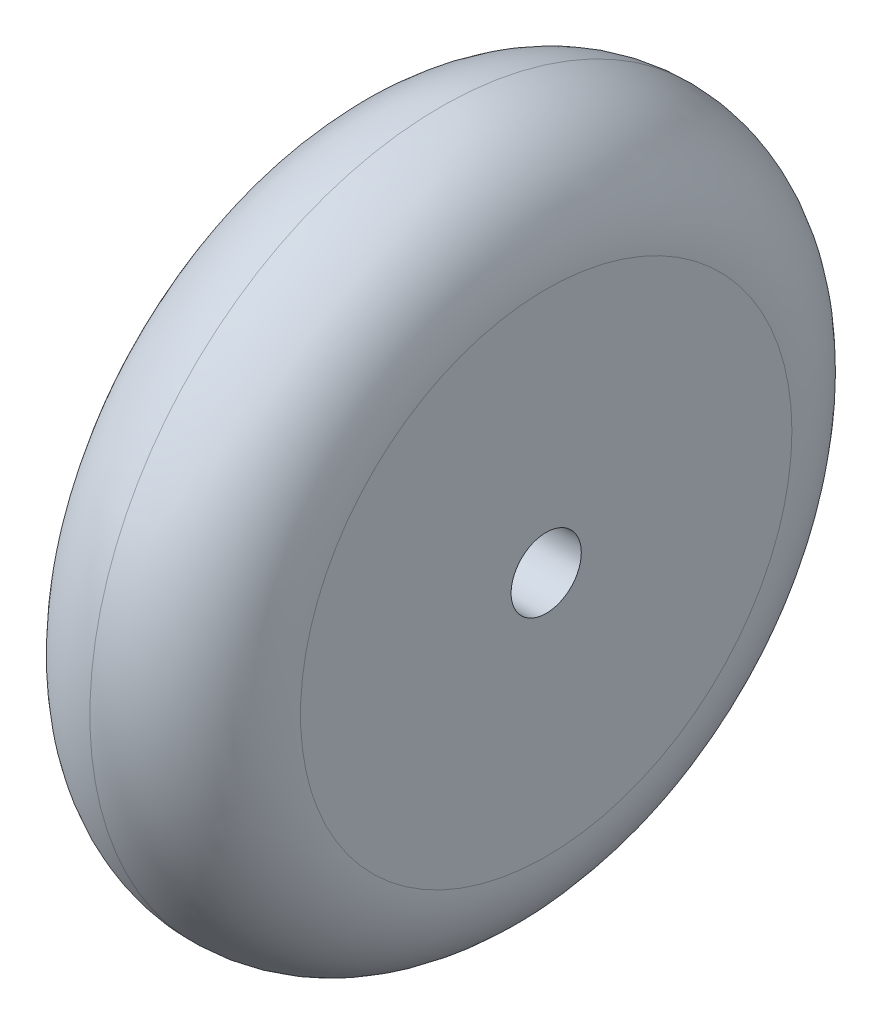
ISO-10303-21;
HEADER;
FILE_DESCRIPTION(('STEP AP214'),'2;1');
FILE_NAME('part.step','',(''),(''),'','','');
FILE_SCHEMA(('AUTOMOTIVE_DESIGN { 1 0 10303 214 1 1 1 1 }'));
ENDSEC;
DATA;
#1=APPLICATION_CONTEXT('core data for automotive mechanical design processes');
#2=APPLICATION_PROTOCOL_DEFINITION('international standard','automotive_design',2000,#1);
#3=PRODUCT_CONTEXT('',#1,'mechanical');
#4=PRODUCT('Part','Part','',(#3));
#5=PRODUCT_RELATED_PRODUCT_CATEGORY('part','',(#4));
#6=PRODUCT_DEFINITION_FORMATION('','',#4);
#7=PRODUCT_DEFINITION_CONTEXT('part definition',#1,'design');
#8=PRODUCT_DEFINITION('design','',#6,#7);
#9=PRODUCT_DEFINITION_SHAPE('','',#8);
#10=(LENGTH_UNIT() NAMED_UNIT(*) SI_UNIT(.MILLI.,.METRE.));
#11=(NAMED_UNIT(*) PLANE_ANGLE_UNIT() SI_UNIT($,.RADIAN.));
#12=(NAMED_UNIT(*) SI_UNIT($,.STERADIAN.) SOLID_ANGLE_UNIT());
#13=UNCERTAINTY_MEASURE_WITH_UNIT(LENGTH_MEASURE(1.E-05),#10,'distance_accuracy_value','');
#14=(GEOMETRIC_REPRESENTATION_CONTEXT(3) GLOBAL_UNCERTAINTY_ASSIGNED_CONTEXT((#13)) GLOBAL_UNIT_ASSIGNED_CONTEXT((#10,
#11,#12)) REPRESENTATION_CONTEXT('',''));
#15=CARTESIAN_POINT('',(0.,0.,0.));
#16=DIRECTION('',(0.,0.,1.));
#17=DIRECTION('',(1.,0.,0.));
#18=AXIS2_PLACEMENT_3D('',#15,#16,#17);
#19=CARTESIAN_POINT('',(24.,0.,0.));
#20=DIRECTION('',(1.,0.,0.));
#21=DIRECTION('',(0.,0.,-1.));
#22=AXIS2_PLACEMENT_3D('',#19,#20,#21);
#23=PLANE('',#22);
#24=CARTESIAN_POINT('',(24.,0.,0.));
#25=DIRECTION('',(1.,0.,0.));
#26=DIRECTION('',(0.,0.,-1.));
#27=AXIS2_PLACEMENT_3D('',#24,#25,#26);
#28=CIRCLE('',#27,28.);
#29=CARTESIAN_POINT('',(24.,0.,-28.));
#30=VERTEX_POINT('',#29);
#31=EDGE_CURVE('E10',#30,#30,#28,.T.);
#32=ORIENTED_EDGE('',*,*,#31,.T.);
#33=EDGE_LOOP('',(#32));
#34=FACE_BOUND('',#33,.T.);
#35=CARTESIAN_POINT('',(24.,0.,0.));
#36=DIRECTION('',(1.,0.,0.));
#37=DIRECTION('',(0.,0.,-1.));
#38=AXIS2_PLACEMENT_3D('',#35,#36,#37);
#39=CIRCLE('',#38,4.);
#40=CARTESIAN_POINT('',(24.,0.,-4.));
#41=VERTEX_POINT('',#40);
#42=EDGE_CURVE('E47',#41,#41,#39,.T.);
#43=ORIENTED_EDGE('',*,*,#42,.F.);
#44=EDGE_LOOP('',(#43));
#45=FACE_BOUND('',#44,.T.);
#46=ADVANCED_FACE('F35',(#34,#45),#23,.T.);
#47=CARTESIAN_POINT('',(0.,0.,0.));
#48=DIRECTION('',(1.,0.,0.));
#49=DIRECTION('',(0.,0.,-1.));
#50=AXIS2_PLACEMENT_3D('',#47,#48,#49);
#51=PLANE('',#50);
#52=CARTESIAN_POINT('',(0.,0.,0.));
#53=DIRECTION('',(1.,0.,0.));
#54=DIRECTION('',(0.,0.,-1.));
#55=AXIS2_PLACEMENT_3D('',#52,#53,#54);
#56=CIRCLE('',#55,28.);
#57=CARTESIAN_POINT('',(0.,0.,-28.));
#58=VERTEX_POINT('',#57);
#59=EDGE_CURVE('E43',#58,#58,#56,.F.);
#60=ORIENTED_EDGE('',*,*,#59,.T.);
#61=EDGE_LOOP('',(#60));
#62=FACE_BOUND('',#61,.T.);
#63=CARTESIAN_POINT('',(0.,0.,0.));
#64=DIRECTION('',(1.,0.,0.));
#65=DIRECTION('',(0.,0.,-1.));
#66=AXIS2_PLACEMENT_3D('',#63,#64,#65);
#67=CIRCLE('',#66,4.);
#68=CARTESIAN_POINT('',(0.,0.,-4.));
#69=VERTEX_POINT('',#68);
#70=EDGE_CURVE('E50',#69,#69,#67,.T.);
#71=ORIENTED_EDGE('',*,*,#70,.T.);
#72=EDGE_LOOP('',(#71));
#73=FACE_BOUND('',#72,.T.);
#74=ADVANCED_FACE('F60',(#62,#73),#51,.F.);
#75=CARTESIAN_POINT('',(24.,0.,0.));
#76=DIRECTION('',(-1.,0.,0.));
#77=DIRECTION('',(0.,0.,1.));
#78=AXIS2_PLACEMENT_3D('',#75,#76,#77);
#79=CYLINDRICAL_SURFACE('',#78,4.);
#80=ORIENTED_EDGE('',*,*,#42,.T.);
#81=EDGE_LOOP('',(#80));
#82=FACE_BOUND('',#81,.T.);
#83=ORIENTED_EDGE('',*,*,#70,.F.);
#84=EDGE_LOOP('',(#83));
#85=FACE_BOUND('',#84,.T.);
#86=ADVANCED_FACE('F56',(#82,#85),#79,.F.);
#87=CARTESIAN_POINT('',(12.,0.,0.));
#88=DIRECTION('',(1.,0.,0.));
#89=DIRECTION('',(0.,0.,-1.));
#90=AXIS2_PLACEMENT_3D('',#87,#88,#89);
#91=TOROIDAL_SURFACE('',#90,28.,12.);
#92=ORIENTED_EDGE('',*,*,#31,.F.);
#93=EDGE_LOOP('',(#92));
#94=FACE_BOUND('',#93,.T.);
#95=CARTESIAN_POINT('',(12.,0.,0.));
#96=DIRECTION('',(1.,0.,0.));
#97=DIRECTION('',(0.,0.,-1.));
#98=AXIS2_PLACEMENT_3D('',#95,#96,#97);
#99=CIRCLE('',#98,40.);
#100=CARTESIAN_POINT('',(12.,0.,-40.));
#101=VERTEX_POINT('',#100);
#102=EDGE_CURVE('E39',#101,#101,#99,.F.);
#103=ORIENTED_EDGE('',*,*,#102,.F.);
#104=EDGE_LOOP('',(#103));
#105=FACE_BOUND('',#104,.T.);
#106=ADVANCED_FACE('F37',(#94,#105),#91,.T.);
#107=CARTESIAN_POINT('',(12.,0.,0.));
#108=DIRECTION('',(1.,0.,0.));
#109=DIRECTION('',(0.,0.,-1.));
#110=AXIS2_PLACEMENT_3D('',#107,#108,#109);
#111=TOROIDAL_SURFACE('',#110,28.,12.);
#112=ORIENTED_EDGE('',*,*,#59,.F.);
#113=EDGE_LOOP('',(#112));
#114=FACE_BOUND('',#113,.T.);
#115=ORIENTED_EDGE('',*,*,#102,.T.);
#116=EDGE_LOOP('',(#115));
#117=FACE_BOUND('',#116,.T.);
#118=ADVANCED_FACE('F68',(#114,#117),#111,.T.);
#119=CLOSED_SHELL('',(#46,#74,#86,#106,#118));
#120=MANIFOLD_SOLID_BREP('B2',#119);
#121=ADVANCED_BREP_SHAPE_REPRESENTATION('',(#18,#120),#14);
#122=SHAPE_DEFINITION_REPRESENTATION(#9,#121);
ENDSEC;
END-ISO-10303-21;
